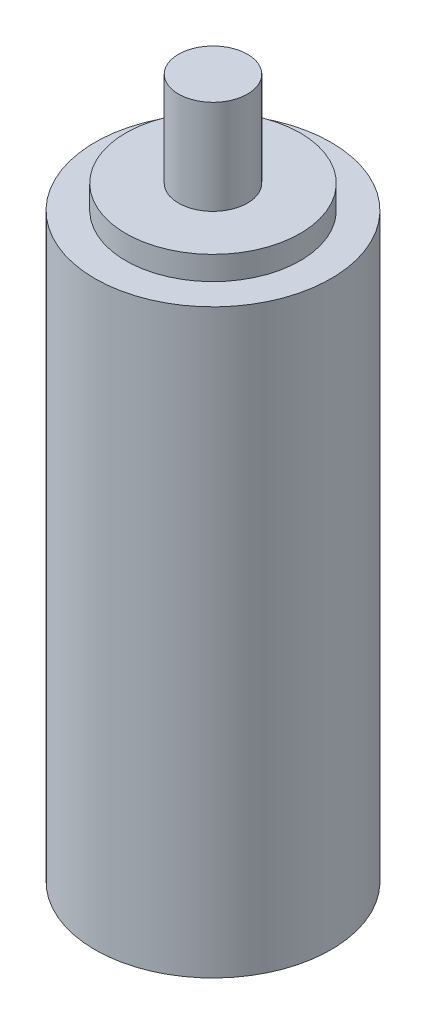
ISO-10303-21;
HEADER;
FILE_DESCRIPTION(('STEP AP214'),'2;1');
FILE_NAME('part.step','',(''),(''),'','','');
FILE_SCHEMA(('AUTOMOTIVE_DESIGN { 1 0 10303 214 1 1 1 1 }'));
ENDSEC;
DATA;
#1=APPLICATION_CONTEXT('core data for automotive mechanical design processes');
#2=APPLICATION_PROTOCOL_DEFINITION('international standard','automotive_design',2000,#1);
#3=PRODUCT_CONTEXT('',#1,'mechanical');
#4=PRODUCT('Part','Part','',(#3));
#5=PRODUCT_RELATED_PRODUCT_CATEGORY('part','',(#4));
#6=PRODUCT_DEFINITION_FORMATION('','',#4);
#7=PRODUCT_DEFINITION_CONTEXT('part definition',#1,'design');
#8=PRODUCT_DEFINITION('design','',#6,#7);
#9=PRODUCT_DEFINITION_SHAPE('','',#8);
#10=(LENGTH_UNIT() NAMED_UNIT(*) SI_UNIT(.MILLI.,.METRE.));
#11=(NAMED_UNIT(*) PLANE_ANGLE_UNIT() SI_UNIT($,.RADIAN.));
#12=(NAMED_UNIT(*) SI_UNIT($,.STERADIAN.) SOLID_ANGLE_UNIT());
#13=UNCERTAINTY_MEASURE_WITH_UNIT(LENGTH_MEASURE(1.E-05),#10,'distance_accuracy_value','');
#14=(GEOMETRIC_REPRESENTATION_CONTEXT(3) GLOBAL_UNCERTAINTY_ASSIGNED_CONTEXT((#13)) GLOBAL_UNIT_ASSIGNED_CONTEXT((#10,
#11,#12)) REPRESENTATION_CONTEXT('',''));
#15=CARTESIAN_POINT('',(0.,0.,0.));
#16=DIRECTION('',(0.,0.,1.));
#17=DIRECTION('',(1.,0.,0.));
#18=AXIS2_PLACEMENT_3D('',#15,#16,#17);
#19=CARTESIAN_POINT('',(0.,160.,0.));
#20=DIRECTION('',(0.,-1.,0.));
#21=DIRECTION('',(0.,0.,-1.));
#22=AXIS2_PLACEMENT_3D('',#19,#20,#21);
#23=CYLINDRICAL_SURFACE('',#22,32.5);
#24=CARTESIAN_POINT('',(0.,160.,0.));
#25=DIRECTION('',(0.,1.,0.));
#26=DIRECTION('',(0.,0.,1.));
#27=AXIS2_PLACEMENT_3D('',#24,#25,#26);
#28=CIRCLE('',#27,32.5);
#29=CARTESIAN_POINT('',(0.,160.,32.5));
#30=VERTEX_POINT('',#29);
#31=EDGE_CURVE('E10',#30,#30,#28,.T.);
#32=ORIENTED_EDGE('',*,*,#31,.F.);
#33=EDGE_LOOP('',(#32));
#34=FACE_BOUND('',#33,.T.);
#35=CARTESIAN_POINT('',(0.,0.,0.));
#36=DIRECTION('',(0.,1.,0.));
#37=DIRECTION('',(0.,0.,1.));
#38=AXIS2_PLACEMENT_3D('',#35,#36,#37);
#39=CIRCLE('',#38,32.5);
#40=CARTESIAN_POINT('',(0.,0.,32.5));
#41=VERTEX_POINT('',#40);
#42=EDGE_CURVE('E33',#41,#41,#39,.T.);
#43=ORIENTED_EDGE('',*,*,#42,.T.);
#44=EDGE_LOOP('',(#43));
#45=FACE_BOUND('',#44,.T.);
#46=ADVANCED_FACE('F30',(#34,#45),#23,.T.);
#47=CARTESIAN_POINT('',(0.,160.,0.));
#48=DIRECTION('',(0.,1.,0.));
#49=DIRECTION('',(0.,0.,1.));
#50=AXIS2_PLACEMENT_3D('',#47,#48,#49);
#51=PLANE('',#50);
#52=CARTESIAN_POINT('',(0.,160.,0.));
#53=DIRECTION('',(0.,1.,0.));
#54=DIRECTION('',(0.,0.,1.));
#55=AXIS2_PLACEMENT_3D('',#52,#53,#54);
#56=CIRCLE('',#55,24.);
#57=CARTESIAN_POINT('',(0.,160.,-24.));
#58=VERTEX_POINT('',#57);
#59=EDGE_CURVE('E42',#58,#58,#56,.T.);
#60=ORIENTED_EDGE('',*,*,#59,.F.);
#61=EDGE_LOOP('',(#60));
#62=FACE_BOUND('',#61,.T.);
#63=ORIENTED_EDGE('',*,*,#31,.T.);
#64=EDGE_LOOP('',(#63));
#65=FACE_BOUND('',#64,.T.);
#66=ADVANCED_FACE('F75',(#62,#65),#51,.T.);
#67=CARTESIAN_POINT('',(0.,0.,0.));
#68=DIRECTION('',(0.,1.,0.));
#69=DIRECTION('',(0.,0.,1.));
#70=AXIS2_PLACEMENT_3D('',#67,#68,#69);
#71=PLANE('',#70);
#72=ORIENTED_EDGE('',*,*,#42,.F.);
#73=EDGE_LOOP('',(#72));
#74=FACE_BOUND('',#73,.T.);
#75=ADVANCED_FACE('F71',(#74),#71,.F.);
#76=CARTESIAN_POINT('',(0.,166.5,0.));
#77=DIRECTION('',(0.,-1.,0.));
#78=DIRECTION('',(0.,0.,-1.));
#79=AXIS2_PLACEMENT_3D('',#76,#77,#78);
#80=CYLINDRICAL_SURFACE('',#79,24.);
#81=CARTESIAN_POINT('',(0.,166.5,0.));
#82=DIRECTION('',(0.,1.,0.));
#83=DIRECTION('',(0.,0.,1.));
#84=AXIS2_PLACEMENT_3D('',#81,#82,#83);
#85=CIRCLE('',#84,24.);
#86=CARTESIAN_POINT('',(0.,166.5,-24.));
#87=VERTEX_POINT('',#86);
#88=EDGE_CURVE('E40',#87,#87,#85,.T.);
#89=CARTESIAN_POINT('',(0.,166.5,-24.));
#90=CARTESIAN_POINT('',(0.,166.432291666667,-24.));
#91=CARTESIAN_POINT('',(0.,166.364583333333,-24.));
#92=CARTESIAN_POINT('',(0.,166.229166666667,-24.));
#93=CARTESIAN_POINT('',(0.,166.161458333333,-24.));
#94=CARTESIAN_POINT('',(0.,166.026041666667,-24.));
#95=CARTESIAN_POINT('',(0.,165.958333333333,-24.));
#96=CARTESIAN_POINT('',(0.,165.822916666667,-24.));
#97=CARTESIAN_POINT('',(0.,165.755208333333,-24.));
#98=CARTESIAN_POINT('',(0.,165.619791666667,-24.));
#99=CARTESIAN_POINT('',(0.,165.552083333333,-24.));
#100=CARTESIAN_POINT('',(0.,165.416666666667,-24.));
#101=CARTESIAN_POINT('',(0.,165.348958333333,-24.));
#102=CARTESIAN_POINT('',(0.,165.213541666667,-24.));
#103=CARTESIAN_POINT('',(0.,165.145833333333,-24.));
#104=CARTESIAN_POINT('',(0.,165.010416666667,-24.));
#105=CARTESIAN_POINT('',(0.,164.942708333333,-24.));
#106=CARTESIAN_POINT('',(0.,164.807291666667,-24.));
#107=CARTESIAN_POINT('',(0.,164.739583333333,-24.));
#108=CARTESIAN_POINT('',(0.,164.604166666667,-24.));
#109=CARTESIAN_POINT('',(0.,164.536458333333,-24.));
#110=CARTESIAN_POINT('',(0.,164.401041666667,-24.));
#111=CARTESIAN_POINT('',(0.,164.333333333333,-24.));
#112=CARTESIAN_POINT('',(0.,164.197916666667,-24.));
#113=CARTESIAN_POINT('',(0.,164.130208333333,-24.));
#114=CARTESIAN_POINT('',(0.,163.994791666667,-24.));
#115=CARTESIAN_POINT('',(0.,163.927083333333,-24.));
#116=CARTESIAN_POINT('',(0.,163.791666666667,-24.));
#117=CARTESIAN_POINT('',(0.,163.723958333333,-24.));
#118=CARTESIAN_POINT('',(0.,163.588541666667,-24.));
#119=CARTESIAN_POINT('',(0.,163.520833333333,-24.));
#120=CARTESIAN_POINT('',(0.,163.385416666667,-24.));
#121=CARTESIAN_POINT('',(0.,163.317708333333,-24.));
#122=CARTESIAN_POINT('',(0.,163.182291666667,-24.));
#123=CARTESIAN_POINT('',(0.,163.114583333333,-24.));
#124=CARTESIAN_POINT('',(0.,162.979166666667,-24.));
#125=CARTESIAN_POINT('',(0.,162.911458333333,-24.));
#126=CARTESIAN_POINT('',(0.,162.776041666667,-24.));
#127=CARTESIAN_POINT('',(0.,162.708333333333,-24.));
#128=CARTESIAN_POINT('',(0.,162.572916666667,-24.));
#129=CARTESIAN_POINT('',(0.,162.505208333333,-24.));
#130=CARTESIAN_POINT('',(0.,162.369791666667,-24.));
#131=CARTESIAN_POINT('',(0.,162.302083333333,-24.));
#132=CARTESIAN_POINT('',(0.,162.166666666667,-24.));
#133=CARTESIAN_POINT('',(0.,162.098958333333,-24.));
#134=CARTESIAN_POINT('',(0.,161.963541666667,-24.));
#135=CARTESIAN_POINT('',(0.,161.895833333333,-24.));
#136=CARTESIAN_POINT('',(0.,161.760416666667,-24.));
#137=CARTESIAN_POINT('',(0.,161.692708333333,-24.));
#138=CARTESIAN_POINT('',(0.,161.557291666667,-24.));
#139=CARTESIAN_POINT('',(0.,161.489583333333,-24.));
#140=CARTESIAN_POINT('',(0.,161.354166666667,-24.));
#141=CARTESIAN_POINT('',(0.,161.286458333333,-24.));
#142=CARTESIAN_POINT('',(0.,161.151041666667,-24.));
#143=CARTESIAN_POINT('',(0.,161.083333333333,-24.));
#144=CARTESIAN_POINT('',(0.,160.947916666667,-24.));
#145=CARTESIAN_POINT('',(0.,160.880208333333,-24.));
#146=CARTESIAN_POINT('',(0.,160.744791666667,-24.));
#147=CARTESIAN_POINT('',(0.,160.677083333333,-24.));
#148=CARTESIAN_POINT('',(0.,160.541666666667,-24.));
#149=CARTESIAN_POINT('',(0.,160.473958333333,-24.));
#150=CARTESIAN_POINT('',(0.,160.338541666667,-24.));
#151=CARTESIAN_POINT('',(0.,160.270833333333,-24.));
#152=CARTESIAN_POINT('',(0.,160.135416666667,-24.));
#153=CARTESIAN_POINT('',(0.,160.067708333333,-24.));
#154=CARTESIAN_POINT('',(0.,160.,-24.));
#155=B_SPLINE_CURVE_WITH_KNOTS('',3,(#89,#90,#91,#92,#93,#94,#95,#96,#97,#98,#99,#100,#101,#102,
#103,#104,#105,#106,#107,#108,#109,#110,#111,#112,#113,#114,#115,#116,#117,#118,#119,#120,#121,
#122,#123,#124,#125,#126,#127,#128,#129,#130,#131,#132,#133,#134,#135,#136,#137,#138,#139,#140,
#141,#142,#143,#144,#145,#146,#147,#148,#149,#150,#151,#152,#153,#154),.UNSPECIFIED.,.F.,.F.,(4,
2,2,2,2,2,2,2,2,2,2,2,2,2,2,2,2,2,2,2,2,2,2,2,2,2,2,2,2,2,2,2,4),(0.,0.203125000000026,
0.406250000000025,0.609375000000023,0.812500000000022,1.01562500000002,1.21875000000002,
1.42187500000002,1.62500000000002,1.82812500000001,2.03125000000001,2.23437500000001,
2.43750000000001,2.64062500000001,2.84375000000001,3.046875,3.25,3.45312500000003,
3.65625000000003,3.85937500000003,4.06250000000002,4.26562500000002,4.46875000000002,
4.67187500000002,4.87500000000002,5.07812500000002,5.28125000000002,5.48437500000001,
5.68750000000001,5.89062500000001,6.09375000000001,6.29687500000001,6.50000000000001),.UNSPECIFIED.);
#156=EDGE_CURVE('BSEAM65',#87,#58,#155,.T.);
#157=ORIENTED_EDGE('',*,*,#88,.F.);
#158=ORIENTED_EDGE('',*,*,#59,.T.);
#159=ORIENTED_EDGE('',*,*,#156,.T.);
#160=ORIENTED_EDGE('',*,*,#156,.F.);
#161=EDGE_LOOP('',(#157,#159,#158,#160));
#162=FACE_BOUND('',#161,.T.);
#163=ADVANCED_FACE('F65',(#162),#80,.T.);
#164=CARTESIAN_POINT('',(0.,166.5,0.));
#165=DIRECTION('',(0.,1.,0.));
#166=DIRECTION('',(0.,0.,1.));
#167=AXIS2_PLACEMENT_3D('',#164,#165,#166);
#168=PLANE('',#167);
#169=CARTESIAN_POINT('',(0.,166.5,0.));
#170=DIRECTION('',(0.,1.,0.));
#171=DIRECTION('',(0.,0.,1.));
#172=AXIS2_PLACEMENT_3D('',#169,#170,#171);
#173=CIRCLE('',#172,9.5);
#174=CARTESIAN_POINT('',(0.,166.5,-9.5));
#175=VERTEX_POINT('',#174);
#176=EDGE_CURVE('E48',#175,#175,#173,.T.);
#177=ORIENTED_EDGE('',*,*,#176,.F.);
#178=EDGE_LOOP('',(#177));
#179=FACE_BOUND('',#178,.T.);
#180=ORIENTED_EDGE('',*,*,#88,.T.);
#181=EDGE_LOOP('',(#180));
#182=FACE_BOUND('',#181,.T.);
#183=ADVANCED_FACE('F59',(#179,#182),#168,.T.);
#184=CARTESIAN_POINT('',(0.,192.5,0.));
#185=DIRECTION('',(0.,-1.,0.));
#186=DIRECTION('',(0.,0.,-1.));
#187=AXIS2_PLACEMENT_3D('',#184,#185,#186);
#188=CYLINDRICAL_SURFACE('',#187,9.5);
#189=CARTESIAN_POINT('',(0.,192.5,0.));
#190=DIRECTION('',(0.,1.,0.));
#191=DIRECTION('',(0.,0.,1.));
#192=AXIS2_PLACEMENT_3D('',#189,#190,#191);
#193=CIRCLE('',#192,9.5);
#194=CARTESIAN_POINT('',(0.,192.5,-9.5));
#195=VERTEX_POINT('',#194);
#196=EDGE_CURVE('E45',#195,#195,#193,.T.);
#197=CARTESIAN_POINT('',(0.,192.5,-9.5));
#198=CARTESIAN_POINT('',(0.,192.229166666667,-9.5));
#199=CARTESIAN_POINT('',(0.,191.958333333333,-9.5));
#200=CARTESIAN_POINT('',(0.,191.416666666667,-9.5));
#201=CARTESIAN_POINT('',(0.,191.145833333333,-9.5));
#202=CARTESIAN_POINT('',(0.,190.604166666667,-9.5));
#203=CARTESIAN_POINT('',(0.,190.333333333333,-9.5));
#204=CARTESIAN_POINT('',(0.,189.791666666667,-9.5));
#205=CARTESIAN_POINT('',(0.,189.520833333333,-9.5));
#206=CARTESIAN_POINT('',(0.,188.979166666667,-9.5));
#207=CARTESIAN_POINT('',(0.,188.708333333333,-9.5));
#208=CARTESIAN_POINT('',(0.,188.166666666667,-9.5));
#209=CARTESIAN_POINT('',(0.,187.895833333333,-9.5));
#210=CARTESIAN_POINT('',(0.,187.354166666667,-9.5));
#211=CARTESIAN_POINT('',(0.,187.083333333333,-9.5));
#212=CARTESIAN_POINT('',(0.,186.541666666667,-9.5));
#213=CARTESIAN_POINT('',(0.,186.270833333333,-9.5));
#214=CARTESIAN_POINT('',(0.,185.729166666667,-9.5));
#215=CARTESIAN_POINT('',(0.,185.458333333333,-9.5));
#216=CARTESIAN_POINT('',(0.,184.916666666667,-9.5));
#217=CARTESIAN_POINT('',(0.,184.645833333333,-9.5));
#218=CARTESIAN_POINT('',(0.,184.104166666667,-9.5));
#219=CARTESIAN_POINT('',(0.,183.833333333333,-9.5));
#220=CARTESIAN_POINT('',(0.,183.291666666667,-9.5));
#221=CARTESIAN_POINT('',(0.,183.020833333333,-9.5));
#222=CARTESIAN_POINT('',(0.,182.479166666667,-9.5));
#223=CARTESIAN_POINT('',(0.,182.208333333333,-9.5));
#224=CARTESIAN_POINT('',(0.,181.666666666667,-9.5));
#225=CARTESIAN_POINT('',(0.,181.395833333333,-9.5));
#226=CARTESIAN_POINT('',(0.,180.854166666667,-9.5));
#227=CARTESIAN_POINT('',(0.,180.583333333333,-9.5));
#228=CARTESIAN_POINT('',(0.,180.041666666667,-9.5));
#229=CARTESIAN_POINT('',(0.,179.770833333333,-9.5));
#230=CARTESIAN_POINT('',(0.,179.229166666667,-9.5));
#231=CARTESIAN_POINT('',(0.,178.958333333333,-9.5));
#232=CARTESIAN_POINT('',(0.,178.416666666667,-9.5));
#233=CARTESIAN_POINT('',(0.,178.145833333333,-9.5));
#234=CARTESIAN_POINT('',(0.,177.604166666667,-9.5));
#235=CARTESIAN_POINT('',(0.,177.333333333333,-9.5));
#236=CARTESIAN_POINT('',(0.,176.791666666667,-9.5));
#237=CARTESIAN_POINT('',(0.,176.520833333333,-9.5));
#238=CARTESIAN_POINT('',(0.,175.979166666667,-9.5));
#239=CARTESIAN_POINT('',(0.,175.708333333333,-9.5));
#240=CARTESIAN_POINT('',(0.,175.166666666667,-9.5));
#241=CARTESIAN_POINT('',(0.,174.895833333333,-9.5));
#242=CARTESIAN_POINT('',(0.,174.354166666667,-9.5));
#243=CARTESIAN_POINT('',(0.,174.083333333333,-9.5));
#244=CARTESIAN_POINT('',(0.,173.541666666667,-9.5));
#245=CARTESIAN_POINT('',(0.,173.270833333333,-9.5));
#246=CARTESIAN_POINT('',(0.,172.729166666667,-9.5));
#247=CARTESIAN_POINT('',(0.,172.458333333333,-9.5));
#248=CARTESIAN_POINT('',(0.,171.916666666667,-9.5));
#249=CARTESIAN_POINT('',(0.,171.645833333333,-9.5));
#250=CARTESIAN_POINT('',(0.,171.104166666667,-9.5));
#251=CARTESIAN_POINT('',(0.,170.833333333333,-9.5));
#252=CARTESIAN_POINT('',(0.,170.291666666667,-9.5));
#253=CARTESIAN_POINT('',(0.,170.020833333333,-9.5));
#254=CARTESIAN_POINT('',(0.,169.479166666667,-9.5));
#255=CARTESIAN_POINT('',(0.,169.208333333333,-9.5));
#256=CARTESIAN_POINT('',(0.,168.666666666667,-9.5));
#257=CARTESIAN_POINT('',(0.,168.395833333333,-9.5));
#258=CARTESIAN_POINT('',(0.,167.854166666667,-9.5));
#259=CARTESIAN_POINT('',(0.,167.583333333333,-9.5));
#260=CARTESIAN_POINT('',(0.,167.041666666667,-9.5));
#261=CARTESIAN_POINT('',(0.,166.770833333333,-9.5));
#262=CARTESIAN_POINT('',(0.,166.5,-9.5));
#263=B_SPLINE_CURVE_WITH_KNOTS('',3,(#197,#198,#199,#200,#201,#202,#203,#204,#205,#206,#207,
#208,#209,#210,#211,#212,#213,#214,#215,#216,#217,#218,#219,#220,#221,#222,#223,#224,#225,#226,
#227,#228,#229,#230,#231,#232,#233,#234,#235,#236,#237,#238,#239,#240,#241,#242,#243,#244,#245,
#246,#247,#248,#249,#250,#251,#252,#253,#254,#255,#256,#257,#258,#259,#260,#261,#262),
.UNSPECIFIED.,.F.,.F.,(4,2,2,2,2,2,2,2,2,2,2,2,2,2,2,2,2,2,2,2,2,2,2,2,2,2,2,2,2,2,2,2,4),(0.,
0.812500000000022,1.62500000000002,2.43750000000001,3.25,4.06250000000002,4.87500000000002,
5.68750000000001,6.50000000000001,7.3125,8.12500000000002,8.93750000000001,9.75000000000001,
10.5625,11.375,12.1875,13.,13.8125,14.625,15.4375,16.25,17.0625,17.875,18.6875,19.5,20.3125,
21.125,21.9375,22.75,23.5625,24.375,25.1875,26.),.UNSPECIFIED.);
#264=EDGE_CURVE('BSEAM56',#195,#175,#263,.T.);
#265=ORIENTED_EDGE('',*,*,#196,.F.);
#266=ORIENTED_EDGE('',*,*,#176,.T.);
#267=ORIENTED_EDGE('',*,*,#264,.T.);
#268=ORIENTED_EDGE('',*,*,#264,.F.);
#269=EDGE_LOOP('',(#265,#267,#266,#268));
#270=FACE_BOUND('',#269,.T.);
#271=ADVANCED_FACE('F56',(#270),#188,.T.);
#272=CARTESIAN_POINT('',(0.,192.5,0.));
#273=DIRECTION('',(0.,1.,0.));
#274=DIRECTION('',(0.,0.,1.));
#275=AXIS2_PLACEMENT_3D('',#272,#273,#274);
#276=PLANE('',#275);
#277=ORIENTED_EDGE('',*,*,#196,.T.);
#278=EDGE_LOOP('',(#277));
#279=FACE_BOUND('',#278,.T.);
#280=ADVANCED_FACE('F54',(#279),#276,.T.);
#281=CLOSED_SHELL('',(#46,#66,#75,#163,#183,#271,#280));
#282=MANIFOLD_SOLID_BREP('B2',#281);
#283=ADVANCED_BREP_SHAPE_REPRESENTATION('',(#18,#282),#14);
#284=SHAPE_DEFINITION_REPRESENTATION(#9,#283);
ENDSEC;
END-ISO-10303-21;
